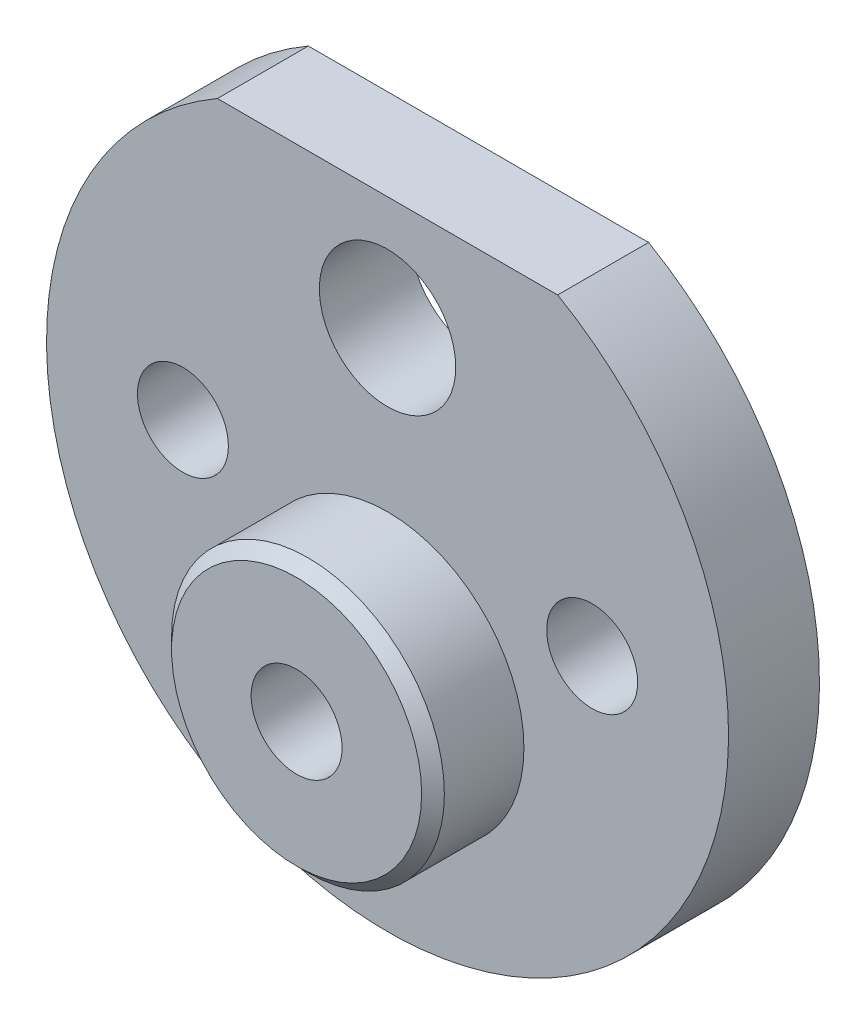
ISO-10303-21;
HEADER;
FILE_DESCRIPTION(('STEP AP214'),'2;1');
FILE_NAME('part.step','',(''),(''),'','','');
FILE_SCHEMA(('AUTOMOTIVE_DESIGN { 1 0 10303 214 1 1 1 1 }'));
ENDSEC;
DATA;
#1=APPLICATION_CONTEXT('core data for automotive mechanical design processes');
#2=APPLICATION_PROTOCOL_DEFINITION('international standard','automotive_design',2000,#1);
#3=PRODUCT_CONTEXT('',#1,'mechanical');
#4=PRODUCT('Part','Part','',(#3));
#5=PRODUCT_RELATED_PRODUCT_CATEGORY('part','',(#4));
#6=PRODUCT_DEFINITION_FORMATION('','',#4);
#7=PRODUCT_DEFINITION_CONTEXT('part definition',#1,'design');
#8=PRODUCT_DEFINITION('design','',#6,#7);
#9=PRODUCT_DEFINITION_SHAPE('','',#8);
#10=(LENGTH_UNIT() NAMED_UNIT(*) SI_UNIT(.MILLI.,.METRE.));
#11=(NAMED_UNIT(*) PLANE_ANGLE_UNIT() SI_UNIT($,.RADIAN.));
#12=(NAMED_UNIT(*) SI_UNIT($,.STERADIAN.) SOLID_ANGLE_UNIT());
#13=UNCERTAINTY_MEASURE_WITH_UNIT(LENGTH_MEASURE(1.E-05),#10,'distance_accuracy_value','');
#14=(GEOMETRIC_REPRESENTATION_CONTEXT(3) GLOBAL_UNCERTAINTY_ASSIGNED_CONTEXT((#13)) GLOBAL_UNIT_ASSIGNED_CONTEXT((#10,
#11,#12)) REPRESENTATION_CONTEXT('',''));
#15=CARTESIAN_POINT('',(0.,0.,0.));
#16=DIRECTION('',(0.,0.,1.));
#17=DIRECTION('',(1.,0.,0.));
#18=AXIS2_PLACEMENT_3D('',#15,#16,#17);
#19=CARTESIAN_POINT('',(0.,0.,4.));
#20=DIRECTION('',(0.,0.,1.));
#21=DIRECTION('',(1.,0.,0.));
#22=AXIS2_PLACEMENT_3D('',#19,#20,#21);
#23=PLANE('',#22);
#24=CARTESIAN_POINT('',(0.,-5.,4.));
#25=DIRECTION('',(0.,0.,1.));
#26=DIRECTION('',(1.,0.,0.));
#27=AXIS2_PLACEMENT_3D('',#24,#25,#26);
#28=CIRCLE('',#27,6.);
#29=CARTESIAN_POINT('',(6.,-5.,4.));
#30=VERTEX_POINT('',#29);
#31=EDGE_CURVE('E193',#30,#30,#28,.T.);
#32=ORIENTED_EDGE('',*,*,#31,.F.);
#33=EDGE_LOOP('',(#32));
#34=FACE_BOUND('',#33,.T.);
#35=CARTESIAN_POINT('',(0.,8.,4.));
#36=DIRECTION('',(0.,0.,1.));
#37=DIRECTION('',(1.,0.,0.));
#38=AXIS2_PLACEMENT_3D('',#35,#36,#37);
#39=CIRCLE('',#38,3.);
#40=CARTESIAN_POINT('',(3.,8.,4.));
#41=VERTEX_POINT('',#40);
#42=EDGE_CURVE('E208',#41,#41,#39,.T.);
#43=ORIENTED_EDGE('',*,*,#42,.F.);
#44=EDGE_LOOP('',(#43));
#45=FACE_BOUND('',#44,.T.);
#46=CARTESIAN_POINT('',(0.,0.,4.));
#47=DIRECTION('',(0.,0.,1.));
#48=DIRECTION('',(1.,0.,0.));
#49=AXIS2_PLACEMENT_3D('',#46,#47,#48);
#50=CIRCLE('',#49,15.);
#51=CARTESIAN_POINT('',(-7.48331477354788,13.,4.));
#52=VERTEX_POINT('',#51);
#53=CARTESIAN_POINT('',(7.48331477354788,13.,4.));
#54=VERTEX_POINT('',#53);
#55=EDGE_CURVE('E67',#52,#54,#50,.T.);
#56=ORIENTED_EDGE('',*,*,#55,.T.);
#57=DIRECTION('',(-1.,0.,0.));
#58=VECTOR('',#57,1.);
#59=CARTESIAN_POINT('',(-7.48331477354788,13.,4.));
#60=LINE('',#59,#58);
#61=EDGE_CURVE('E49',#54,#52,#60,.T.);
#62=ORIENTED_EDGE('',*,*,#61,.T.);
#63=EDGE_LOOP('',(#56,#62));
#64=FACE_BOUND('',#63,.T.);
#65=CARTESIAN_POINT('',(-9.,0.,4.));
#66=DIRECTION('',(0.,0.,1.));
#67=DIRECTION('',(1.,0.,0.));
#68=AXIS2_PLACEMENT_3D('',#65,#66,#67);
#69=CIRCLE('',#68,2.);
#70=CARTESIAN_POINT('',(-7.,0.,4.));
#71=VERTEX_POINT('',#70);
#72=EDGE_CURVE('E75',#71,#71,#69,.T.);
#73=ORIENTED_EDGE('',*,*,#72,.F.);
#74=EDGE_LOOP('',(#73));
#75=FACE_BOUND('',#74,.T.);
#76=CARTESIAN_POINT('',(9.,0.,4.));
#77=DIRECTION('',(0.,0.,1.));
#78=DIRECTION('',(1.,0.,0.));
#79=AXIS2_PLACEMENT_3D('',#76,#77,#78);
#80=CIRCLE('',#79,2.);
#81=CARTESIAN_POINT('',(11.,0.,4.));
#82=VERTEX_POINT('',#81);
#83=EDGE_CURVE('E198',#82,#82,#80,.T.);
#84=ORIENTED_EDGE('',*,*,#83,.F.);
#85=EDGE_LOOP('',(#84));
#86=FACE_BOUND('',#85,.T.);
#87=ADVANCED_FACE('F33',(#34,#45,#64,#75,#86),#23,.T.);
#88=CARTESIAN_POINT('',(0.,0.,0.));
#89=DIRECTION('',(0.,0.,1.));
#90=DIRECTION('',(1.,0.,0.));
#91=AXIS2_PLACEMENT_3D('',#88,#89,#90);
#92=PLANE('',#91);
#93=CARTESIAN_POINT('',(0.,-5.,0.));
#94=DIRECTION('',(0.,0.,1.));
#95=DIRECTION('',(1.,0.,0.));
#96=AXIS2_PLACEMENT_3D('',#93,#94,#95);
#97=CIRCLE('',#96,2.);
#98=CARTESIAN_POINT('',(2.,-5.,0.));
#99=VERTEX_POINT('',#98);
#100=EDGE_CURVE('E195',#99,#99,#97,.T.);
#101=ORIENTED_EDGE('',*,*,#100,.T.);
#102=EDGE_LOOP('',(#101));
#103=FACE_BOUND('',#102,.T.);
#104=CARTESIAN_POINT('',(0.,0.,0.));
#105=DIRECTION('',(0.,0.,1.));
#106=DIRECTION('',(1.,0.,0.));
#107=AXIS2_PLACEMENT_3D('',#104,#105,#106);
#108=CIRCLE('',#107,15.);
#109=CARTESIAN_POINT('',(-7.48331477354788,13.,0.));
#110=VERTEX_POINT('',#109);
#111=CARTESIAN_POINT('',(7.48331477354788,13.,0.));
#112=VERTEX_POINT('',#111);
#113=EDGE_CURVE('E68',#110,#112,#108,.T.);
#114=ORIENTED_EDGE('',*,*,#113,.F.);
#115=DIRECTION('',(-1.,0.,0.));
#116=VECTOR('',#115,1.);
#117=CARTESIAN_POINT('',(-7.48331477354788,13.,0.));
#118=LINE('',#117,#116);
#119=EDGE_CURVE('E57',#112,#110,#118,.T.);
#120=ORIENTED_EDGE('',*,*,#119,.F.);
#121=EDGE_LOOP('',(#114,#120));
#122=FACE_BOUND('',#121,.T.);
#123=CARTESIAN_POINT('',(-9.,0.,0.));
#124=DIRECTION('',(0.,0.,1.));
#125=DIRECTION('',(1.,0.,0.));
#126=AXIS2_PLACEMENT_3D('',#123,#124,#125);
#127=CIRCLE('',#126,2.);
#128=CARTESIAN_POINT('',(-7.,0.,0.));
#129=VERTEX_POINT('',#128);
#130=EDGE_CURVE('E78',#129,#129,#127,.T.);
#131=ORIENTED_EDGE('',*,*,#130,.T.);
#132=EDGE_LOOP('',(#131));
#133=FACE_BOUND('',#132,.T.);
#134=CARTESIAN_POINT('',(0.,8.,0.));
#135=DIRECTION('',(0.,0.,1.));
#136=DIRECTION('',(1.,0.,0.));
#137=AXIS2_PLACEMENT_3D('',#134,#135,#136);
#138=CIRCLE('',#137,3.);
#139=CARTESIAN_POINT('',(3.,8.,0.));
#140=VERTEX_POINT('',#139);
#141=EDGE_CURVE('E206',#140,#140,#138,.T.);
#142=ORIENTED_EDGE('',*,*,#141,.T.);
#143=EDGE_LOOP('',(#142));
#144=FACE_BOUND('',#143,.T.);
#145=CARTESIAN_POINT('',(9.,0.,0.));
#146=DIRECTION('',(0.,0.,1.));
#147=DIRECTION('',(1.,0.,0.));
#148=AXIS2_PLACEMENT_3D('',#145,#146,#147);
#149=CIRCLE('',#148,2.);
#150=CARTESIAN_POINT('',(11.,0.,0.));
#151=VERTEX_POINT('',#150);
#152=EDGE_CURVE('E194',#151,#151,#149,.T.);
#153=ORIENTED_EDGE('',*,*,#152,.T.);
#154=EDGE_LOOP('',(#153));
#155=FACE_BOUND('',#154,.T.);
#156=ADVANCED_FACE('F73',(#103,#122,#133,#144,#155),#92,.F.);
#157=CARTESIAN_POINT('',(0.,0.,4.));
#158=DIRECTION('',(0.,0.,-1.));
#159=DIRECTION('',(-1.,0.,0.));
#160=AXIS2_PLACEMENT_3D('',#157,#158,#159);
#161=CYLINDRICAL_SURFACE('',#160,15.);
#162=ORIENTED_EDGE('',*,*,#113,.T.);
#163=DIRECTION('',(0.,0.,-1.));
#164=VECTOR('',#163,1.);
#165=CARTESIAN_POINT('',(7.48331477354788,13.,4.));
#166=LINE('',#165,#164);
#167=EDGE_CURVE('E65',#54,#112,#166,.T.);
#168=ORIENTED_EDGE('',*,*,#167,.F.);
#169=ORIENTED_EDGE('',*,*,#55,.F.);
#170=DIRECTION('',(0.,0.,-1.));
#171=VECTOR('',#170,1.);
#172=CARTESIAN_POINT('',(-7.48331477354788,13.,4.));
#173=LINE('',#172,#171);
#174=EDGE_CURVE('E62',#52,#110,#173,.T.);
#175=ORIENTED_EDGE('',*,*,#174,.T.);
#176=EDGE_LOOP('',(#162,#168,#169,#175));
#177=FACE_BOUND('',#176,.T.);
#178=ADVANCED_FACE('F71',(#177),#161,.T.);
#179=CARTESIAN_POINT('',(-7.48331477354788,13.,4.));
#180=DIRECTION('',(0.,-1.,0.));
#181=DIRECTION('',(0.,0.,-1.));
#182=AXIS2_PLACEMENT_3D('',#179,#180,#181);
#183=PLANE('',#182);
#184=ORIENTED_EDGE('',*,*,#119,.T.);
#185=ORIENTED_EDGE('',*,*,#174,.F.);
#186=ORIENTED_EDGE('',*,*,#61,.F.);
#187=ORIENTED_EDGE('',*,*,#167,.T.);
#188=EDGE_LOOP('',(#184,#185,#186,#187));
#189=FACE_BOUND('',#188,.T.);
#190=ADVANCED_FACE('F61',(#189),#183,.F.);
#191=CARTESIAN_POINT('',(-9.,0.,4.));
#192=DIRECTION('',(0.,0.,-1.));
#193=DIRECTION('',(-1.,0.,0.));
#194=AXIS2_PLACEMENT_3D('',#191,#192,#193);
#195=CYLINDRICAL_SURFACE('',#194,2.);
#196=ORIENTED_EDGE('',*,*,#72,.T.);
#197=EDGE_LOOP('',(#196));
#198=FACE_BOUND('',#197,.T.);
#199=ORIENTED_EDGE('',*,*,#130,.F.);
#200=EDGE_LOOP('',(#199));
#201=FACE_BOUND('',#200,.T.);
#202=ADVANCED_FACE('F109',(#198,#201),#195,.F.);
#203=CARTESIAN_POINT('',(0.,8.,4.));
#204=DIRECTION('',(0.,0.,-1.));
#205=DIRECTION('',(-1.,0.,0.));
#206=AXIS2_PLACEMENT_3D('',#203,#204,#205);
#207=CYLINDRICAL_SURFACE('',#206,3.);
#208=ORIENTED_EDGE('',*,*,#42,.T.);
#209=EDGE_LOOP('',(#208));
#210=FACE_BOUND('',#209,.T.);
#211=ORIENTED_EDGE('',*,*,#141,.F.);
#212=EDGE_LOOP('',(#211));
#213=FACE_BOUND('',#212,.T.);
#214=ADVANCED_FACE('F128',(#210,#213),#207,.F.);
#215=CARTESIAN_POINT('',(9.,0.,4.));
#216=DIRECTION('',(0.,0.,-1.));
#217=DIRECTION('',(-1.,0.,0.));
#218=AXIS2_PLACEMENT_3D('',#215,#216,#217);
#219=CYLINDRICAL_SURFACE('',#218,2.);
#220=ORIENTED_EDGE('',*,*,#83,.T.);
#221=EDGE_LOOP('',(#220));
#222=FACE_BOUND('',#221,.T.);
#223=ORIENTED_EDGE('',*,*,#152,.F.);
#224=EDGE_LOOP('',(#223));
#225=FACE_BOUND('',#224,.T.);
#226=ADVANCED_FACE('F135',(#222,#225),#219,.F.);
#227=CARTESIAN_POINT('',(0.,-5.,8.));
#228=DIRECTION('',(0.,0.,-1.));
#229=DIRECTION('',(-1.,0.,0.));
#230=AXIS2_PLACEMENT_3D('',#227,#228,#229);
#231=CYLINDRICAL_SURFACE('',#230,6.);
#232=CARTESIAN_POINT('',(0.,-5.,7.50000000000001));
#233=DIRECTION('',(0.,0.,1.));
#234=DIRECTION('',(1.,0.,0.));
#235=AXIS2_PLACEMENT_3D('',#232,#233,#234);
#236=CIRCLE('',#235,6.);
#237=CARTESIAN_POINT('',(6.,-5.,7.50000000000001));
#238=VERTEX_POINT('',#237);
#239=EDGE_CURVE('E11',#238,#238,#236,.F.);
#240=ORIENTED_EDGE('',*,*,#239,.T.);
#241=EDGE_LOOP('',(#240));
#242=FACE_BOUND('',#241,.T.);
#243=ORIENTED_EDGE('',*,*,#31,.T.);
#244=EDGE_LOOP('',(#243));
#245=FACE_BOUND('',#244,.T.);
#246=ADVANCED_FACE('F142',(#242,#245),#231,.T.);
#247=CARTESIAN_POINT('',(0.,-5.,8.));
#248=DIRECTION('',(0.,0.,1.));
#249=DIRECTION('',(1.,0.,0.));
#250=AXIS2_PLACEMENT_3D('',#247,#248,#249);
#251=PLANE('',#250);
#252=CARTESIAN_POINT('',(0.,-5.,8.));
#253=DIRECTION('',(0.,0.,1.));
#254=DIRECTION('',(1.,0.,0.));
#255=AXIS2_PLACEMENT_3D('',#252,#253,#254);
#256=CIRCLE('',#255,5.50000000000001);
#257=CARTESIAN_POINT('',(5.50000000000001,-5.,8.));
#258=VERTEX_POINT('',#257);
#259=EDGE_CURVE('E42',#258,#258,#256,.T.);
#260=ORIENTED_EDGE('',*,*,#259,.T.);
#261=EDGE_LOOP('',(#260));
#262=FACE_BOUND('',#261,.T.);
#263=CARTESIAN_POINT('',(0.,-5.,8.));
#264=DIRECTION('',(0.,0.,1.));
#265=DIRECTION('',(1.,0.,0.));
#266=AXIS2_PLACEMENT_3D('',#263,#264,#265);
#267=CIRCLE('',#266,2.);
#268=CARTESIAN_POINT('',(2.,-5.,8.));
#269=VERTEX_POINT('',#268);
#270=EDGE_CURVE('E201',#269,#269,#267,.T.);
#271=ORIENTED_EDGE('',*,*,#270,.F.);
#272=EDGE_LOOP('',(#271));
#273=FACE_BOUND('',#272,.T.);
#274=ADVANCED_FACE('F86',(#262,#273),#251,.T.);
#275=CARTESIAN_POINT('',(0.,-5.,0.));
#276=DIRECTION('',(0.,0.,1.));
#277=DIRECTION('',(1.,0.,0.));
#278=AXIS2_PLACEMENT_3D('',#275,#276,#277);
#279=CYLINDRICAL_SURFACE('',#278,2.);
#280=ORIENTED_EDGE('',*,*,#100,.F.);
#281=EDGE_LOOP('',(#280));
#282=FACE_BOUND('',#281,.T.);
#283=ORIENTED_EDGE('',*,*,#270,.T.);
#284=EDGE_LOOP('',(#283));
#285=FACE_BOUND('',#284,.T.);
#286=ADVANCED_FACE('F90',(#282,#285),#279,.F.);
#287=CARTESIAN_POINT('',(0.,-5.,8.));
#288=DIRECTION('',(0.,0.,-1.));
#289=DIRECTION('',(-1.,0.,0.));
#290=AXIS2_PLACEMENT_3D('',#287,#288,#289);
#291=CONICAL_SURFACE('',#290,5.50000000000001,0.785398163397451);
#292=ORIENTED_EDGE('',*,*,#239,.F.);
#293=EDGE_LOOP('',(#292));
#294=FACE_BOUND('',#293,.T.);
#295=ORIENTED_EDGE('',*,*,#259,.F.);
#296=EDGE_LOOP('',(#295));
#297=FACE_BOUND('',#296,.T.);
#298=ADVANCED_FACE('F35',(#294,#297),#291,.T.);
#299=CLOSED_SHELL('',(#87,#156,#178,#190,#202,#214,#226,#246,#274,#286,#298));
#300=MANIFOLD_SOLID_BREP('B2',#299);
#301=ADVANCED_BREP_SHAPE_REPRESENTATION('',(#18,#300),#14);
#302=SHAPE_DEFINITION_REPRESENTATION(#9,#301);
ENDSEC;
END-ISO-10303-21;
